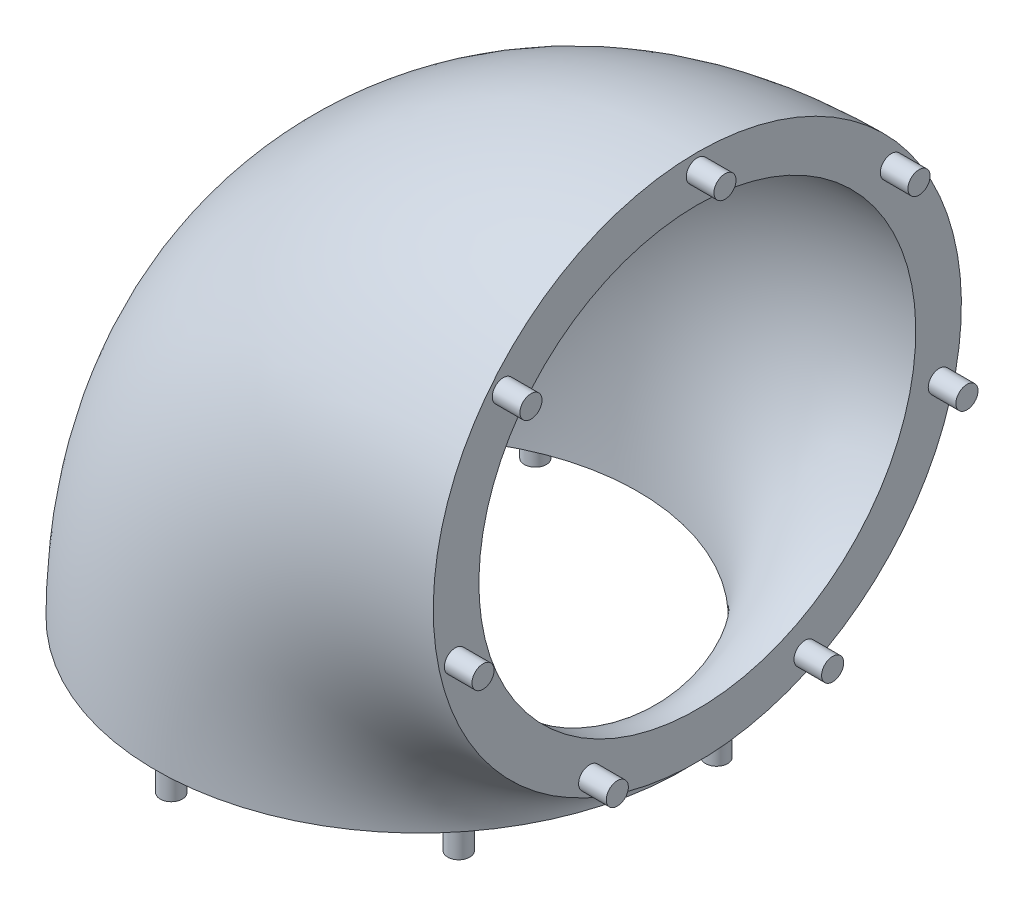
ISO-10303-21;
HEADER;
FILE_DESCRIPTION(('STEP AP214'),'2;1');
FILE_NAME('part.step','',(''),(''),'','','');
FILE_SCHEMA(('AUTOMOTIVE_DESIGN { 1 0 10303 214 1 1 1 1 }'));
ENDSEC;
DATA;
#1=APPLICATION_CONTEXT('core data for automotive mechanical design processes');
#2=APPLICATION_PROTOCOL_DEFINITION('international standard','automotive_design',2000,#1);
#3=PRODUCT_CONTEXT('',#1,'mechanical');
#4=PRODUCT('Part','Part','',(#3));
#5=PRODUCT_RELATED_PRODUCT_CATEGORY('part','',(#4));
#6=PRODUCT_DEFINITION_FORMATION('','',#4);
#7=PRODUCT_DEFINITION_CONTEXT('part definition',#1,'design');
#8=PRODUCT_DEFINITION('design','',#6,#7);
#9=PRODUCT_DEFINITION_SHAPE('','',#8);
#10=(LENGTH_UNIT() NAMED_UNIT(*) SI_UNIT(.MILLI.,.METRE.));
#11=(NAMED_UNIT(*) PLANE_ANGLE_UNIT() SI_UNIT($,.RADIAN.));
#12=(NAMED_UNIT(*) SI_UNIT($,.STERADIAN.) SOLID_ANGLE_UNIT());
#13=UNCERTAINTY_MEASURE_WITH_UNIT(LENGTH_MEASURE(1.E-05),#10,'distance_accuracy_value','');
#14=(GEOMETRIC_REPRESENTATION_CONTEXT(3) GLOBAL_UNCERTAINTY_ASSIGNED_CONTEXT((#13)) GLOBAL_UNIT_ASSIGNED_CONTEXT((#10,
#11,#12)) REPRESENTATION_CONTEXT('',''));
#15=CARTESIAN_POINT('',(0.,0.,0.));
#16=DIRECTION('',(0.,0.,1.));
#17=DIRECTION('',(1.,0.,0.));
#18=AXIS2_PLACEMENT_3D('',#15,#16,#17);
#19=CARTESIAN_POINT('',(100.5,79.,0.));
#20=DIRECTION('',(0.,0.,-1.));
#21=DIRECTION('',(-1.,0.,0.));
#22=AXIS2_PLACEMENT_3D('',#19,#20,#21);
#23=TOROIDAL_SURFACE('',#22,100.5,95.5);
#24=CARTESIAN_POINT('',(0.,79.,0.));
#25=DIRECTION('',(0.,1.,0.));
#26=DIRECTION('',(0.,0.,1.));
#27=AXIS2_PLACEMENT_3D('',#24,#25,#26);
#28=CIRCLE('',#27,95.5);
#29=CARTESIAN_POINT('',(-95.5,79.,0.));
#30=VERTEX_POINT('',#29);
#31=EDGE_CURVE('E55',#30,#30,#28,.T.);
#32=CARTESIAN_POINT('',(100.5,179.5,0.));
#33=DIRECTION('',(1.,0.,0.));
#34=DIRECTION('',(0.,0.,1.));
#35=AXIS2_PLACEMENT_3D('',#32,#33,#34);
#36=CIRCLE('',#35,95.5);
#37=CARTESIAN_POINT('',(100.5,275.,0.));
#38=VERTEX_POINT('',#37);
#39=EDGE_CURVE('E42',#38,#38,#36,.T.);
#40=CARTESIAN_POINT('',(100.5,79.,0.));
#41=DIRECTION('',(0.,0.,-1.));
#42=DIRECTION('',(-1.,0.,0.));
#43=AXIS2_PLACEMENT_3D('',#40,#41,#42);
#44=CIRCLE('',#43,196.);
#45=EDGE_CURVE('',#30,#38,#44,.T.);
#46=ORIENTED_EDGE('',*,*,#31,.T.);
#47=ORIENTED_EDGE('',*,*,#39,.F.);
#48=ORIENTED_EDGE('',*,*,#45,.T.);
#49=ORIENTED_EDGE('',*,*,#45,.F.);
#50=EDGE_LOOP('',(#46,#48,#47,#49));
#51=FACE_BOUND('',#50,.T.);
#52=ADVANCED_FACE('F39',(#51),#23,.T.);
#53=CARTESIAN_POINT('',(100.5,79.,0.));
#54=DIRECTION('',(0.,0.,-1.));
#55=DIRECTION('',(-1.,0.,0.));
#56=AXIS2_PLACEMENT_3D('',#53,#54,#55);
#57=TOROIDAL_SURFACE('',#56,100.5,79.);
#58=CARTESIAN_POINT('',(0.,79.,0.));
#59=DIRECTION('',(0.,1.,0.));
#60=DIRECTION('',(0.,0.,1.));
#61=AXIS2_PLACEMENT_3D('',#58,#59,#60);
#62=CIRCLE('',#61,79.);
#63=CARTESIAN_POINT('',(-79.,79.,0.));
#64=VERTEX_POINT('',#63);
#65=EDGE_CURVE('E47',#64,#64,#62,.F.);
#66=CARTESIAN_POINT('',(100.5,179.5,0.));
#67=DIRECTION('',(1.,0.,0.));
#68=DIRECTION('',(0.,0.,1.));
#69=AXIS2_PLACEMENT_3D('',#66,#67,#68);
#70=CIRCLE('',#69,79.);
#71=CARTESIAN_POINT('',(100.5,258.5,0.));
#72=VERTEX_POINT('',#71);
#73=EDGE_CURVE('E10',#72,#72,#70,.F.);
#74=CARTESIAN_POINT('',(100.5,79.,0.));
#75=DIRECTION('',(0.,0.,-1.));
#76=DIRECTION('',(-1.,0.,0.));
#77=AXIS2_PLACEMENT_3D('',#74,#75,#76);
#78=CIRCLE('',#77,179.5);
#79=EDGE_CURVE('',#64,#72,#78,.T.);
#80=ORIENTED_EDGE('',*,*,#65,.T.);
#81=ORIENTED_EDGE('',*,*,#73,.F.);
#82=ORIENTED_EDGE('',*,*,#79,.T.);
#83=ORIENTED_EDGE('',*,*,#79,.F.);
#84=EDGE_LOOP('',(#80,#82,#81,#83));
#85=FACE_BOUND('',#84,.T.);
#86=ADVANCED_FACE('F207',(#85),#57,.F.);
#87=CARTESIAN_POINT('',(0.,79.,0.));
#88=DIRECTION('',(0.,-1.,0.));
#89=DIRECTION('',(0.,0.,-1.));
#90=AXIS2_PLACEMENT_3D('',#87,#88,#89);
#91=PLANE('',#90);
#92=CARTESIAN_POINT('',(-70.1693755515057,79.,55.9582097168213));
#93=DIRECTION('',(0.,-1.,0.));
#94=DIRECTION('',(0.,0.,-1.));
#95=AXIS2_PLACEMENT_3D('',#92,#93,#94);
#96=CIRCLE('',#95,4.00000000000107);
#97=CARTESIAN_POINT('',(-70.1693755515057,79.,51.9582097168202));
#98=VERTEX_POINT('',#97);
#99=EDGE_CURVE('E113',#98,#98,#96,.T.);
#100=ORIENTED_EDGE('',*,*,#99,.F.);
#101=EDGE_LOOP('',(#100));
#102=FACE_BOUND('',#101,.T.);
#103=CARTESIAN_POINT('',(-87.4997801183187,79.,-19.9712538225792));
#104=DIRECTION('',(0.,-1.,0.));
#105=DIRECTION('',(0.,0.,-1.));
#106=AXIS2_PLACEMENT_3D('',#103,#104,#105);
#107=CIRCLE('',#106,4.00000000000082);
#108=CARTESIAN_POINT('',(-87.4997801183187,79.,-23.9712538225801));
#109=VERTEX_POINT('',#108);
#110=EDGE_CURVE('E105',#109,#109,#107,.T.);
#111=ORIENTED_EDGE('',*,*,#110,.F.);
#112=EDGE_LOOP('',(#111));
#113=FACE_BOUND('',#112,.T.);
#114=CARTESIAN_POINT('',(-38.9410655858008,79.,-80.8619558942421));
#115=DIRECTION('',(0.,-1.,0.));
#116=DIRECTION('',(0.,0.,-1.));
#117=AXIS2_PLACEMENT_3D('',#114,#115,#116);
#118=CIRCLE('',#117,4.00000000000067);
#119=CARTESIAN_POINT('',(-38.9410655858008,79.,-84.8619558942428));
#120=VERTEX_POINT('',#119);
#121=EDGE_CURVE('E97',#120,#120,#118,.T.);
#122=ORIENTED_EDGE('',*,*,#121,.F.);
#123=EDGE_LOOP('',(#122));
#124=FACE_BOUND('',#123,.T.);
#125=CARTESIAN_POINT('',(38.9410655858009,79.,-80.8619558942421));
#126=DIRECTION('',(0.,-1.,0.));
#127=DIRECTION('',(0.,0.,-1.));
#128=AXIS2_PLACEMENT_3D('',#125,#126,#127);
#129=CIRCLE('',#128,4.00000000000055);
#130=CARTESIAN_POINT('',(38.9410655858009,79.,-84.8619558942427));
#131=VERTEX_POINT('',#130);
#132=EDGE_CURVE('E89',#131,#131,#129,.T.);
#133=ORIENTED_EDGE('',*,*,#132,.F.);
#134=EDGE_LOOP('',(#133));
#135=FACE_BOUND('',#134,.T.);
#136=CARTESIAN_POINT('',(87.4997801183187,79.,-19.9712538225792));
#137=DIRECTION('',(0.,-1.,0.));
#138=DIRECTION('',(0.,0.,-1.));
#139=AXIS2_PLACEMENT_3D('',#136,#137,#138);
#140=CIRCLE('',#139,4.00000000000035);
#141=CARTESIAN_POINT('',(87.4997801183187,79.,-23.9712538225796));
#142=VERTEX_POINT('',#141);
#143=EDGE_CURVE('E81',#142,#142,#140,.T.);
#144=ORIENTED_EDGE('',*,*,#143,.F.);
#145=EDGE_LOOP('',(#144));
#146=FACE_BOUND('',#145,.T.);
#147=CARTESIAN_POINT('',(70.1693755515057,79.,55.9582097168213));
#148=DIRECTION('',(0.,-1.,0.));
#149=DIRECTION('',(0.,0.,-1.));
#150=AXIS2_PLACEMENT_3D('',#147,#148,#149);
#151=CIRCLE('',#150,4.00000000000016);
#152=CARTESIAN_POINT('',(70.1693755515057,79.,51.9582097168212));
#153=VERTEX_POINT('',#152);
#154=EDGE_CURVE('E73',#153,#153,#151,.T.);
#155=ORIENTED_EDGE('',*,*,#154,.F.);
#156=EDGE_LOOP('',(#155));
#157=FACE_BOUND('',#156,.T.);
#158=CARTESIAN_POINT('',(0.,79.,89.75));
#159=DIRECTION('',(0.,-1.,0.));
#160=DIRECTION('',(0.,0.,-1.));
#161=AXIS2_PLACEMENT_3D('',#158,#159,#160);
#162=CIRCLE('',#161,4.);
#163=CARTESIAN_POINT('',(0.,79.,85.75));
#164=VERTEX_POINT('',#163);
#165=EDGE_CURVE('E65',#164,#164,#162,.T.);
#166=ORIENTED_EDGE('',*,*,#165,.F.);
#167=EDGE_LOOP('',(#166));
#168=FACE_BOUND('',#167,.T.);
#169=ORIENTED_EDGE('',*,*,#65,.F.);
#170=EDGE_LOOP('',(#169));
#171=FACE_BOUND('',#170,.T.);
#172=ORIENTED_EDGE('',*,*,#31,.F.);
#173=EDGE_LOOP('',(#172));
#174=FACE_BOUND('',#173,.T.);
#175=ADVANCED_FACE('F190',(#102,#113,#124,#135,#146,#157,#168,#171,#174),#91,.T.);
#176=CARTESIAN_POINT('',(100.5,179.5,0.));
#177=DIRECTION('',(1.,0.,0.));
#178=DIRECTION('',(0.,1.,0.));
#179=AXIS2_PLACEMENT_3D('',#176,#177,#178);
#180=PLANE('',#179);
#181=CARTESIAN_POINT('',(100.5,235.458209716822,70.169375551505));
#182=DIRECTION('',(1.,0.,0.));
#183=DIRECTION('',(0.,1.,0.));
#184=AXIS2_PLACEMENT_3D('',#181,#182,#183);
#185=CIRCLE('',#184,4.);
#186=CARTESIAN_POINT('',(100.5,239.458209716822,70.169375551505));
#187=VERTEX_POINT('',#186);
#188=EDGE_CURVE('E169',#187,#187,#185,.T.);
#189=ORIENTED_EDGE('',*,*,#188,.F.);
#190=EDGE_LOOP('',(#189));
#191=FACE_BOUND('',#190,.T.);
#192=CARTESIAN_POINT('',(100.5,159.528746177422,87.4997801183189));
#193=DIRECTION('',(1.,0.,0.));
#194=DIRECTION('',(0.,1.,0.));
#195=AXIS2_PLACEMENT_3D('',#192,#193,#194);
#196=CIRCLE('',#195,3.99999999999998);
#197=CARTESIAN_POINT('',(100.5,163.528746177422,87.4997801183189));
#198=VERTEX_POINT('',#197);
#199=EDGE_CURVE('E161',#198,#198,#196,.T.);
#200=ORIENTED_EDGE('',*,*,#199,.F.);
#201=EDGE_LOOP('',(#200));
#202=FACE_BOUND('',#201,.T.);
#203=CARTESIAN_POINT('',(100.5,98.6380441057581,38.9410655858015));
#204=DIRECTION('',(1.,0.,0.));
#205=DIRECTION('',(0.,1.,0.));
#206=AXIS2_PLACEMENT_3D('',#203,#204,#205);
#207=CIRCLE('',#206,3.99999999999999);
#208=CARTESIAN_POINT('',(100.5,102.638044105758,38.9410655858015));
#209=VERTEX_POINT('',#208);
#210=EDGE_CURVE('E153',#209,#209,#207,.T.);
#211=ORIENTED_EDGE('',*,*,#210,.F.);
#212=EDGE_LOOP('',(#211));
#213=FACE_BOUND('',#212,.T.);
#214=CARTESIAN_POINT('',(100.5,98.6380441057576,-38.9410655858004));
#215=DIRECTION('',(1.,0.,0.));
#216=DIRECTION('',(0.,1.,0.));
#217=AXIS2_PLACEMENT_3D('',#214,#215,#216);
#218=CIRCLE('',#217,3.99999999999998);
#219=CARTESIAN_POINT('',(100.5,102.638044105758,-38.9410655858004));
#220=VERTEX_POINT('',#219);
#221=EDGE_CURVE('E145',#220,#220,#218,.T.);
#222=ORIENTED_EDGE('',*,*,#221,.F.);
#223=EDGE_LOOP('',(#222));
#224=FACE_BOUND('',#223,.T.);
#225=CARTESIAN_POINT('',(100.5,159.52874617742,-87.4997801183186));
#226=DIRECTION('',(1.,0.,0.));
#227=DIRECTION('',(0.,1.,0.));
#228=AXIS2_PLACEMENT_3D('',#225,#226,#227);
#229=CIRCLE('',#228,4.00000000000001);
#230=CARTESIAN_POINT('',(100.5,163.52874617742,-87.4997801183186));
#231=VERTEX_POINT('',#230);
#232=EDGE_CURVE('E137',#231,#231,#229,.T.);
#233=ORIENTED_EDGE('',*,*,#232,.F.);
#234=EDGE_LOOP('',(#233));
#235=FACE_BOUND('',#234,.T.);
#236=CARTESIAN_POINT('',(100.5,235.458209716821,-70.1693755515059));
#237=DIRECTION('',(1.,0.,0.));
#238=DIRECTION('',(0.,1.,0.));
#239=AXIS2_PLACEMENT_3D('',#236,#237,#238);
#240=CIRCLE('',#239,4.);
#241=CARTESIAN_POINT('',(100.5,239.458209716821,-70.1693755515059));
#242=VERTEX_POINT('',#241);
#243=EDGE_CURVE('E129',#242,#242,#240,.T.);
#244=ORIENTED_EDGE('',*,*,#243,.F.);
#245=EDGE_LOOP('',(#244));
#246=FACE_BOUND('',#245,.T.);
#247=CARTESIAN_POINT('',(100.5,269.25,0.));
#248=DIRECTION('',(1.,0.,0.));
#249=DIRECTION('',(0.,1.,0.));
#250=AXIS2_PLACEMENT_3D('',#247,#248,#249);
#251=CIRCLE('',#250,4.);
#252=CARTESIAN_POINT('',(100.5,273.25,0.));
#253=VERTEX_POINT('',#252);
#254=EDGE_CURVE('E121',#253,#253,#251,.T.);
#255=ORIENTED_EDGE('',*,*,#254,.F.);
#256=EDGE_LOOP('',(#255));
#257=FACE_BOUND('',#256,.T.);
#258=ORIENTED_EDGE('',*,*,#73,.T.);
#259=EDGE_LOOP('',(#258));
#260=FACE_BOUND('',#259,.T.);
#261=ORIENTED_EDGE('',*,*,#39,.T.);
#262=EDGE_LOOP('',(#261));
#263=FACE_BOUND('',#262,.T.);
#264=ADVANCED_FACE('F186',(#191,#202,#213,#224,#235,#246,#257,#260,#263),#180,.T.);
#265=CARTESIAN_POINT('',(0.,69.,89.75));
#266=DIRECTION('',(0.,1.,0.));
#267=DIRECTION('',(0.,0.,1.));
#268=AXIS2_PLACEMENT_3D('',#265,#266,#267);
#269=CYLINDRICAL_SURFACE('',#268,4.);
#270=CARTESIAN_POINT('',(0.,69.,89.75));
#271=DIRECTION('',(0.,-1.,0.));
#272=DIRECTION('',(0.,0.,-1.));
#273=AXIS2_PLACEMENT_3D('',#270,#271,#272);
#274=CIRCLE('',#273,4.);
#275=CARTESIAN_POINT('',(0.,69.,85.75));
#276=VERTEX_POINT('',#275);
#277=EDGE_CURVE('E58',#276,#276,#274,.T.);
#278=ORIENTED_EDGE('',*,*,#277,.F.);
#279=EDGE_LOOP('',(#278));
#280=FACE_BOUND('',#279,.T.);
#281=ORIENTED_EDGE('',*,*,#165,.T.);
#282=EDGE_LOOP('',(#281));
#283=FACE_BOUND('',#282,.T.);
#284=ADVANCED_FACE('F189',(#280,#283),#269,.T.);
#285=CARTESIAN_POINT('',(0.,69.,89.75));
#286=DIRECTION('',(0.,-1.,0.));
#287=DIRECTION('',(0.,0.,-1.));
#288=AXIS2_PLACEMENT_3D('',#285,#286,#287);
#289=PLANE('',#288);
#290=ORIENTED_EDGE('',*,*,#277,.T.);
#291=EDGE_LOOP('',(#290));
#292=FACE_BOUND('',#291,.T.);
#293=ADVANCED_FACE('F224',(#292),#289,.T.);
#294=CARTESIAN_POINT('',(70.1693755515057,69.,55.9582097168213));
#295=DIRECTION('',(0.,1.,0.));
#296=DIRECTION('',(0.,0.,1.));
#297=AXIS2_PLACEMENT_3D('',#294,#295,#296);
#298=CYLINDRICAL_SURFACE('',#297,4.00000000000016);
#299=CARTESIAN_POINT('',(70.1693755515057,69.,55.9582097168213));
#300=DIRECTION('',(0.,-1.,0.));
#301=DIRECTION('',(0.,0.,-1.));
#302=AXIS2_PLACEMENT_3D('',#299,#300,#301);
#303=CIRCLE('',#302,4.00000000000016);
#304=CARTESIAN_POINT('',(70.1693755515057,69.,51.9582097168212));
#305=VERTEX_POINT('',#304);
#306=EDGE_CURVE('E71',#305,#305,#303,.T.);
#307=ORIENTED_EDGE('',*,*,#306,.F.);
#308=EDGE_LOOP('',(#307));
#309=FACE_BOUND('',#308,.T.);
#310=ORIENTED_EDGE('',*,*,#154,.T.);
#311=EDGE_LOOP('',(#310));
#312=FACE_BOUND('',#311,.T.);
#313=ADVANCED_FACE('F228',(#309,#312),#298,.T.);
#314=CARTESIAN_POINT('',(70.1693755515057,69.,55.9582097168213));
#315=DIRECTION('',(0.,-1.,0.));
#316=DIRECTION('',(0.,0.,-1.));
#317=AXIS2_PLACEMENT_3D('',#314,#315,#316);
#318=PLANE('',#317);
#319=ORIENTED_EDGE('',*,*,#306,.T.);
#320=EDGE_LOOP('',(#319));
#321=FACE_BOUND('',#320,.T.);
#322=ADVANCED_FACE('F231',(#321),#318,.T.);
#323=CARTESIAN_POINT('',(87.4997801183187,69.,-19.9712538225792));
#324=DIRECTION('',(0.,1.,0.));
#325=DIRECTION('',(0.,0.,1.));
#326=AXIS2_PLACEMENT_3D('',#323,#324,#325);
#327=CYLINDRICAL_SURFACE('',#326,4.00000000000035);
#328=CARTESIAN_POINT('',(87.4997801183187,69.,-19.9712538225792));
#329=DIRECTION('',(0.,-1.,0.));
#330=DIRECTION('',(0.,0.,-1.));
#331=AXIS2_PLACEMENT_3D('',#328,#329,#330);
#332=CIRCLE('',#331,4.00000000000035);
#333=CARTESIAN_POINT('',(87.4997801183187,69.,-23.9712538225796));
#334=VERTEX_POINT('',#333);
#335=EDGE_CURVE('E77',#334,#334,#332,.T.);
#336=ORIENTED_EDGE('',*,*,#335,.F.);
#337=EDGE_LOOP('',(#336));
#338=FACE_BOUND('',#337,.T.);
#339=ORIENTED_EDGE('',*,*,#143,.T.);
#340=EDGE_LOOP('',(#339));
#341=FACE_BOUND('',#340,.T.);
#342=ADVANCED_FACE('F235',(#338,#341),#327,.T.);
#343=CARTESIAN_POINT('',(87.4997801183187,69.,-19.9712538225792));
#344=DIRECTION('',(0.,-1.,0.));
#345=DIRECTION('',(0.,0.,-1.));
#346=AXIS2_PLACEMENT_3D('',#343,#344,#345);
#347=PLANE('',#346);
#348=ORIENTED_EDGE('',*,*,#335,.T.);
#349=EDGE_LOOP('',(#348));
#350=FACE_BOUND('',#349,.T.);
#351=ADVANCED_FACE('F239',(#350),#347,.T.);
#352=CARTESIAN_POINT('',(38.9410655858009,69.,-80.8619558942421));
#353=DIRECTION('',(0.,1.,0.));
#354=DIRECTION('',(0.,0.,1.));
#355=AXIS2_PLACEMENT_3D('',#352,#353,#354);
#356=CYLINDRICAL_SURFACE('',#355,4.00000000000055);
#357=CARTESIAN_POINT('',(38.9410655858009,69.,-80.8619558942421));
#358=DIRECTION('',(0.,-1.,0.));
#359=DIRECTION('',(0.,0.,-1.));
#360=AXIS2_PLACEMENT_3D('',#357,#358,#359);
#361=CIRCLE('',#360,4.00000000000055);
#362=CARTESIAN_POINT('',(38.9410655858009,69.,-84.8619558942427));
#363=VERTEX_POINT('',#362);
#364=EDGE_CURVE('E85',#363,#363,#361,.T.);
#365=ORIENTED_EDGE('',*,*,#364,.F.);
#366=EDGE_LOOP('',(#365));
#367=FACE_BOUND('',#366,.T.);
#368=ORIENTED_EDGE('',*,*,#132,.T.);
#369=EDGE_LOOP('',(#368));
#370=FACE_BOUND('',#369,.T.);
#371=ADVANCED_FACE('F243',(#367,#370),#356,.T.);
#372=CARTESIAN_POINT('',(38.9410655858009,69.,-80.8619558942421));
#373=DIRECTION('',(0.,-1.,0.));
#374=DIRECTION('',(0.,0.,-1.));
#375=AXIS2_PLACEMENT_3D('',#372,#373,#374);
#376=PLANE('',#375);
#377=ORIENTED_EDGE('',*,*,#364,.T.);
#378=EDGE_LOOP('',(#377));
#379=FACE_BOUND('',#378,.T.);
#380=ADVANCED_FACE('F247',(#379),#376,.T.);
#381=CARTESIAN_POINT('',(-38.9410655858008,69.,-80.8619558942421));
#382=DIRECTION('',(0.,1.,0.));
#383=DIRECTION('',(0.,0.,1.));
#384=AXIS2_PLACEMENT_3D('',#381,#382,#383);
#385=CYLINDRICAL_SURFACE('',#384,4.00000000000067);
#386=CARTESIAN_POINT('',(-38.9410655858008,69.,-80.8619558942421));
#387=DIRECTION('',(0.,-1.,0.));
#388=DIRECTION('',(0.,0.,-1.));
#389=AXIS2_PLACEMENT_3D('',#386,#387,#388);
#390=CIRCLE('',#389,4.00000000000067);
#391=CARTESIAN_POINT('',(-38.9410655858008,69.,-84.8619558942428));
#392=VERTEX_POINT('',#391);
#393=EDGE_CURVE('E93',#392,#392,#390,.T.);
#394=ORIENTED_EDGE('',*,*,#393,.F.);
#395=EDGE_LOOP('',(#394));
#396=FACE_BOUND('',#395,.T.);
#397=ORIENTED_EDGE('',*,*,#121,.T.);
#398=EDGE_LOOP('',(#397));
#399=FACE_BOUND('',#398,.T.);
#400=ADVANCED_FACE('F251',(#396,#399),#385,.T.);
#401=CARTESIAN_POINT('',(-38.9410655858008,69.,-80.8619558942421));
#402=DIRECTION('',(0.,-1.,0.));
#403=DIRECTION('',(0.,0.,-1.));
#404=AXIS2_PLACEMENT_3D('',#401,#402,#403);
#405=PLANE('',#404);
#406=ORIENTED_EDGE('',*,*,#393,.T.);
#407=EDGE_LOOP('',(#406));
#408=FACE_BOUND('',#407,.T.);
#409=ADVANCED_FACE('F255',(#408),#405,.T.);
#410=CARTESIAN_POINT('',(-87.4997801183187,69.,-19.9712538225792));
#411=DIRECTION('',(0.,1.,0.));
#412=DIRECTION('',(0.,0.,1.));
#413=AXIS2_PLACEMENT_3D('',#410,#411,#412);
#414=CYLINDRICAL_SURFACE('',#413,4.00000000000082);
#415=CARTESIAN_POINT('',(-87.4997801183187,69.,-19.9712538225792));
#416=DIRECTION('',(0.,-1.,0.));
#417=DIRECTION('',(0.,0.,-1.));
#418=AXIS2_PLACEMENT_3D('',#415,#416,#417);
#419=CIRCLE('',#418,4.00000000000082);
#420=CARTESIAN_POINT('',(-87.4997801183187,69.,-23.9712538225801));
#421=VERTEX_POINT('',#420);
#422=EDGE_CURVE('E101',#421,#421,#419,.T.);
#423=ORIENTED_EDGE('',*,*,#422,.F.);
#424=EDGE_LOOP('',(#423));
#425=FACE_BOUND('',#424,.T.);
#426=ORIENTED_EDGE('',*,*,#110,.T.);
#427=EDGE_LOOP('',(#426));
#428=FACE_BOUND('',#427,.T.);
#429=ADVANCED_FACE('F259',(#425,#428),#414,.T.);
#430=CARTESIAN_POINT('',(-87.4997801183187,69.,-19.9712538225792));
#431=DIRECTION('',(0.,-1.,0.));
#432=DIRECTION('',(0.,0.,-1.));
#433=AXIS2_PLACEMENT_3D('',#430,#431,#432);
#434=PLANE('',#433);
#435=ORIENTED_EDGE('',*,*,#422,.T.);
#436=EDGE_LOOP('',(#435));
#437=FACE_BOUND('',#436,.T.);
#438=ADVANCED_FACE('F263',(#437),#434,.T.);
#439=CARTESIAN_POINT('',(-70.1693755515057,69.,55.9582097168213));
#440=DIRECTION('',(0.,1.,0.));
#441=DIRECTION('',(0.,0.,1.));
#442=AXIS2_PLACEMENT_3D('',#439,#440,#441);
#443=CYLINDRICAL_SURFACE('',#442,4.00000000000107);
#444=CARTESIAN_POINT('',(-70.1693755515057,69.,55.9582097168213));
#445=DIRECTION('',(0.,-1.,0.));
#446=DIRECTION('',(0.,0.,-1.));
#447=AXIS2_PLACEMENT_3D('',#444,#445,#446);
#448=CIRCLE('',#447,4.00000000000107);
#449=CARTESIAN_POINT('',(-70.1693755515057,69.,51.9582097168202));
#450=VERTEX_POINT('',#449);
#451=EDGE_CURVE('E109',#450,#450,#448,.T.);
#452=ORIENTED_EDGE('',*,*,#451,.F.);
#453=EDGE_LOOP('',(#452));
#454=FACE_BOUND('',#453,.T.);
#455=ORIENTED_EDGE('',*,*,#99,.T.);
#456=EDGE_LOOP('',(#455));
#457=FACE_BOUND('',#456,.T.);
#458=ADVANCED_FACE('F267',(#454,#457),#443,.T.);
#459=CARTESIAN_POINT('',(-70.1693755515057,69.,55.9582097168213));
#460=DIRECTION('',(0.,-1.,0.));
#461=DIRECTION('',(0.,0.,-1.));
#462=AXIS2_PLACEMENT_3D('',#459,#460,#461);
#463=PLANE('',#462);
#464=ORIENTED_EDGE('',*,*,#451,.T.);
#465=EDGE_LOOP('',(#464));
#466=FACE_BOUND('',#465,.T.);
#467=ADVANCED_FACE('F271',(#466),#463,.T.);
#468=CARTESIAN_POINT('',(110.5,269.25,0.));
#469=DIRECTION('',(-1.,0.,0.));
#470=DIRECTION('',(0.,-1.,0.));
#471=AXIS2_PLACEMENT_3D('',#468,#469,#470);
#472=CYLINDRICAL_SURFACE('',#471,4.);
#473=CARTESIAN_POINT('',(110.5,269.25,0.));
#474=DIRECTION('',(1.,0.,0.));
#475=DIRECTION('',(0.,1.,0.));
#476=AXIS2_PLACEMENT_3D('',#473,#474,#475);
#477=CIRCLE('',#476,4.);
#478=CARTESIAN_POINT('',(110.5,273.25,0.));
#479=VERTEX_POINT('',#478);
#480=EDGE_CURVE('E117',#479,#479,#477,.T.);
#481=ORIENTED_EDGE('',*,*,#480,.F.);
#482=EDGE_LOOP('',(#481));
#483=FACE_BOUND('',#482,.T.);
#484=ORIENTED_EDGE('',*,*,#254,.T.);
#485=EDGE_LOOP('',(#484));
#486=FACE_BOUND('',#485,.T.);
#487=ADVANCED_FACE('F275',(#483,#486),#472,.T.);
#488=CARTESIAN_POINT('',(110.5,269.25,0.));
#489=DIRECTION('',(1.,0.,0.));
#490=DIRECTION('',(0.,1.,0.));
#491=AXIS2_PLACEMENT_3D('',#488,#489,#490);
#492=PLANE('',#491);
#493=ORIENTED_EDGE('',*,*,#480,.T.);
#494=EDGE_LOOP('',(#493));
#495=FACE_BOUND('',#494,.T.);
#496=ADVANCED_FACE('F279',(#495),#492,.T.);
#497=CARTESIAN_POINT('',(110.5,235.458209716821,-70.1693755515059));
#498=DIRECTION('',(-1.,0.,0.));
#499=DIRECTION('',(0.,-1.,0.));
#500=AXIS2_PLACEMENT_3D('',#497,#498,#499);
#501=CYLINDRICAL_SURFACE('',#500,4.);
#502=CARTESIAN_POINT('',(110.5,235.458209716821,-70.1693755515059));
#503=DIRECTION('',(1.,0.,0.));
#504=DIRECTION('',(0.,1.,0.));
#505=AXIS2_PLACEMENT_3D('',#502,#503,#504);
#506=CIRCLE('',#505,4.);
#507=CARTESIAN_POINT('',(110.5,239.458209716821,-70.1693755515059));
#508=VERTEX_POINT('',#507);
#509=EDGE_CURVE('E125',#508,#508,#506,.T.);
#510=ORIENTED_EDGE('',*,*,#509,.F.);
#511=EDGE_LOOP('',(#510));
#512=FACE_BOUND('',#511,.T.);
#513=ORIENTED_EDGE('',*,*,#243,.T.);
#514=EDGE_LOOP('',(#513));
#515=FACE_BOUND('',#514,.T.);
#516=ADVANCED_FACE('F283',(#512,#515),#501,.T.);
#517=CARTESIAN_POINT('',(110.5,235.458209716821,-70.1693755515059));
#518=DIRECTION('',(1.,0.,0.));
#519=DIRECTION('',(0.,1.,0.));
#520=AXIS2_PLACEMENT_3D('',#517,#518,#519);
#521=PLANE('',#520);
#522=ORIENTED_EDGE('',*,*,#509,.T.);
#523=EDGE_LOOP('',(#522));
#524=FACE_BOUND('',#523,.T.);
#525=ADVANCED_FACE('F287',(#524),#521,.T.);
#526=CARTESIAN_POINT('',(110.5,159.52874617742,-87.4997801183186));
#527=DIRECTION('',(-1.,0.,0.));
#528=DIRECTION('',(0.,-1.,0.));
#529=AXIS2_PLACEMENT_3D('',#526,#527,#528);
#530=CYLINDRICAL_SURFACE('',#529,4.00000000000001);
#531=CARTESIAN_POINT('',(110.5,159.52874617742,-87.4997801183186));
#532=DIRECTION('',(1.,0.,0.));
#533=DIRECTION('',(0.,1.,0.));
#534=AXIS2_PLACEMENT_3D('',#531,#532,#533);
#535=CIRCLE('',#534,4.00000000000001);
#536=CARTESIAN_POINT('',(110.5,163.52874617742,-87.4997801183186));
#537=VERTEX_POINT('',#536);
#538=EDGE_CURVE('E133',#537,#537,#535,.T.);
#539=ORIENTED_EDGE('',*,*,#538,.F.);
#540=EDGE_LOOP('',(#539));
#541=FACE_BOUND('',#540,.T.);
#542=ORIENTED_EDGE('',*,*,#232,.T.);
#543=EDGE_LOOP('',(#542));
#544=FACE_BOUND('',#543,.T.);
#545=ADVANCED_FACE('F291',(#541,#544),#530,.T.);
#546=CARTESIAN_POINT('',(110.5,159.52874617742,-87.4997801183186));
#547=DIRECTION('',(1.,0.,0.));
#548=DIRECTION('',(0.,1.,0.));
#549=AXIS2_PLACEMENT_3D('',#546,#547,#548);
#550=PLANE('',#549);
#551=ORIENTED_EDGE('',*,*,#538,.T.);
#552=EDGE_LOOP('',(#551));
#553=FACE_BOUND('',#552,.T.);
#554=ADVANCED_FACE('F295',(#553),#550,.T.);
#555=CARTESIAN_POINT('',(110.5,98.6380441057576,-38.9410655858004));
#556=DIRECTION('',(-1.,0.,0.));
#557=DIRECTION('',(0.,-1.,0.));
#558=AXIS2_PLACEMENT_3D('',#555,#556,#557);
#559=CYLINDRICAL_SURFACE('',#558,3.99999999999998);
#560=CARTESIAN_POINT('',(110.5,98.6380441057576,-38.9410655858004));
#561=DIRECTION('',(1.,0.,0.));
#562=DIRECTION('',(0.,1.,0.));
#563=AXIS2_PLACEMENT_3D('',#560,#561,#562);
#564=CIRCLE('',#563,3.99999999999998);
#565=CARTESIAN_POINT('',(110.5,102.638044105758,-38.9410655858004));
#566=VERTEX_POINT('',#565);
#567=EDGE_CURVE('E141',#566,#566,#564,.T.);
#568=ORIENTED_EDGE('',*,*,#567,.F.);
#569=EDGE_LOOP('',(#568));
#570=FACE_BOUND('',#569,.T.);
#571=ORIENTED_EDGE('',*,*,#221,.T.);
#572=EDGE_LOOP('',(#571));
#573=FACE_BOUND('',#572,.T.);
#574=ADVANCED_FACE('F299',(#570,#573),#559,.T.);
#575=CARTESIAN_POINT('',(110.5,98.6380441057576,-38.9410655858004));
#576=DIRECTION('',(1.,0.,0.));
#577=DIRECTION('',(0.,1.,0.));
#578=AXIS2_PLACEMENT_3D('',#575,#576,#577);
#579=PLANE('',#578);
#580=ORIENTED_EDGE('',*,*,#567,.T.);
#581=EDGE_LOOP('',(#580));
#582=FACE_BOUND('',#581,.T.);
#583=ADVANCED_FACE('F303',(#582),#579,.T.);
#584=CARTESIAN_POINT('',(110.5,98.6380441057581,38.9410655858015));
#585=DIRECTION('',(-1.,0.,0.));
#586=DIRECTION('',(0.,-1.,0.));
#587=AXIS2_PLACEMENT_3D('',#584,#585,#586);
#588=CYLINDRICAL_SURFACE('',#587,3.99999999999999);
#589=CARTESIAN_POINT('',(110.5,98.6380441057581,38.9410655858015));
#590=DIRECTION('',(1.,0.,0.));
#591=DIRECTION('',(0.,1.,0.));
#592=AXIS2_PLACEMENT_3D('',#589,#590,#591);
#593=CIRCLE('',#592,3.99999999999999);
#594=CARTESIAN_POINT('',(110.5,102.638044105758,38.9410655858015));
#595=VERTEX_POINT('',#594);
#596=EDGE_CURVE('E149',#595,#595,#593,.T.);
#597=ORIENTED_EDGE('',*,*,#596,.F.);
#598=EDGE_LOOP('',(#597));
#599=FACE_BOUND('',#598,.T.);
#600=ORIENTED_EDGE('',*,*,#210,.T.);
#601=EDGE_LOOP('',(#600));
#602=FACE_BOUND('',#601,.T.);
#603=ADVANCED_FACE('F307',(#599,#602),#588,.T.);
#604=CARTESIAN_POINT('',(110.5,98.6380441057581,38.9410655858015));
#605=DIRECTION('',(1.,0.,0.));
#606=DIRECTION('',(0.,1.,0.));
#607=AXIS2_PLACEMENT_3D('',#604,#605,#606);
#608=PLANE('',#607);
#609=ORIENTED_EDGE('',*,*,#596,.T.);
#610=EDGE_LOOP('',(#609));
#611=FACE_BOUND('',#610,.T.);
#612=ADVANCED_FACE('F311',(#611),#608,.T.);
#613=CARTESIAN_POINT('',(110.5,159.528746177422,87.4997801183189));
#614=DIRECTION('',(-1.,0.,0.));
#615=DIRECTION('',(0.,-1.,0.));
#616=AXIS2_PLACEMENT_3D('',#613,#614,#615);
#617=CYLINDRICAL_SURFACE('',#616,3.99999999999998);
#618=CARTESIAN_POINT('',(110.5,159.528746177422,87.4997801183189));
#619=DIRECTION('',(1.,0.,0.));
#620=DIRECTION('',(0.,1.,0.));
#621=AXIS2_PLACEMENT_3D('',#618,#619,#620);
#622=CIRCLE('',#621,3.99999999999998);
#623=CARTESIAN_POINT('',(110.5,163.528746177422,87.4997801183189));
#624=VERTEX_POINT('',#623);
#625=EDGE_CURVE('E157',#624,#624,#622,.T.);
#626=ORIENTED_EDGE('',*,*,#625,.F.);
#627=EDGE_LOOP('',(#626));
#628=FACE_BOUND('',#627,.T.);
#629=ORIENTED_EDGE('',*,*,#199,.T.);
#630=EDGE_LOOP('',(#629));
#631=FACE_BOUND('',#630,.T.);
#632=ADVANCED_FACE('F315',(#628,#631),#617,.T.);
#633=CARTESIAN_POINT('',(110.5,159.528746177422,87.4997801183189));
#634=DIRECTION('',(1.,0.,0.));
#635=DIRECTION('',(0.,1.,0.));
#636=AXIS2_PLACEMENT_3D('',#633,#634,#635);
#637=PLANE('',#636);
#638=ORIENTED_EDGE('',*,*,#625,.T.);
#639=EDGE_LOOP('',(#638));
#640=FACE_BOUND('',#639,.T.);
#641=ADVANCED_FACE('F182',(#640),#637,.T.);
#642=CARTESIAN_POINT('',(110.5,235.458209716822,70.169375551505));
#643=DIRECTION('',(-1.,0.,0.));
#644=DIRECTION('',(0.,-1.,0.));
#645=AXIS2_PLACEMENT_3D('',#642,#643,#644);
#646=CYLINDRICAL_SURFACE('',#645,4.);
#647=CARTESIAN_POINT('',(110.5,235.458209716822,70.169375551505));
#648=DIRECTION('',(1.,0.,0.));
#649=DIRECTION('',(0.,1.,0.));
#650=AXIS2_PLACEMENT_3D('',#647,#648,#649);
#651=CIRCLE('',#650,4.);
#652=CARTESIAN_POINT('',(110.5,239.458209716822,70.169375551505));
#653=VERTEX_POINT('',#652);
#654=EDGE_CURVE('E165',#653,#653,#651,.T.);
#655=ORIENTED_EDGE('',*,*,#654,.F.);
#656=EDGE_LOOP('',(#655));
#657=FACE_BOUND('',#656,.T.);
#658=ORIENTED_EDGE('',*,*,#188,.T.);
#659=EDGE_LOOP('',(#658));
#660=FACE_BOUND('',#659,.T.);
#661=ADVANCED_FACE('F179',(#657,#660),#646,.T.);
#662=CARTESIAN_POINT('',(110.5,235.458209716822,70.169375551505));
#663=DIRECTION('',(1.,0.,0.));
#664=DIRECTION('',(0.,1.,0.));
#665=AXIS2_PLACEMENT_3D('',#662,#663,#664);
#666=PLANE('',#665);
#667=ORIENTED_EDGE('',*,*,#654,.T.);
#668=EDGE_LOOP('',(#667));
#669=FACE_BOUND('',#668,.T.);
#670=ADVANCED_FACE('F177',(#669),#666,.T.);
#671=CLOSED_SHELL('',(#52,#86,#175,#264,#284,#293,#313,#322,#342,#351,#371,#380,#400,#409,#429,
#438,#458,#467,#487,#496,#516,#525,#545,#554,#574,#583,#603,#612,#632,#641,#661,#670));
#672=MANIFOLD_SOLID_BREP('B2',#671);
#673=ADVANCED_BREP_SHAPE_REPRESENTATION('',(#18,#672),#14);
#674=SHAPE_DEFINITION_REPRESENTATION(#9,#673);
ENDSEC;
END-ISO-10303-21;
